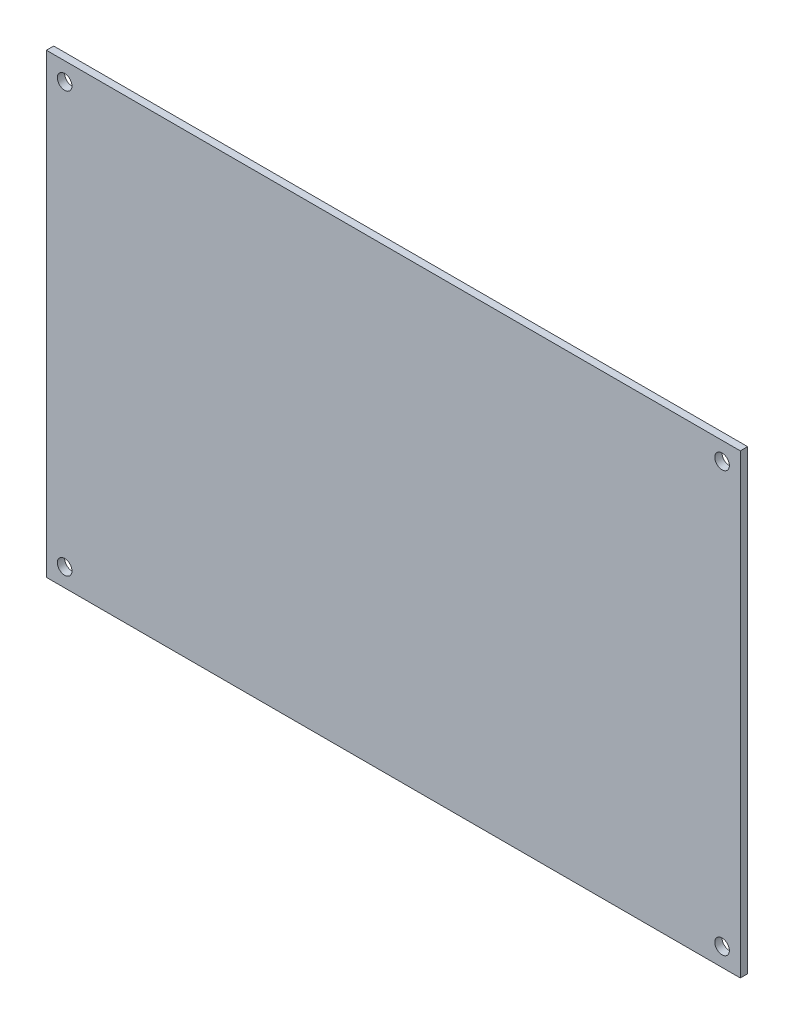
ISO-10303-21;
HEADER;
FILE_DESCRIPTION(('STEP AP214'),'2;1');
FILE_NAME('part.step','',(''),(''),'','','');
FILE_SCHEMA(('AUTOMOTIVE_DESIGN { 1 0 10303 214 1 1 1 1 }'));
ENDSEC;
DATA;
#1=APPLICATION_CONTEXT('core data for automotive mechanical design processes');
#2=APPLICATION_PROTOCOL_DEFINITION('international standard','automotive_design',2000,#1);
#3=PRODUCT_CONTEXT('',#1,'mechanical');
#4=PRODUCT('Part','Part','',(#3));
#5=PRODUCT_RELATED_PRODUCT_CATEGORY('part','',(#4));
#6=PRODUCT_DEFINITION_FORMATION('','',#4);
#7=PRODUCT_DEFINITION_CONTEXT('part definition',#1,'design');
#8=PRODUCT_DEFINITION('design','',#6,#7);
#9=PRODUCT_DEFINITION_SHAPE('','',#8);
#10=(LENGTH_UNIT() NAMED_UNIT(*) SI_UNIT(.MILLI.,.METRE.));
#11=(NAMED_UNIT(*) PLANE_ANGLE_UNIT() SI_UNIT($,.RADIAN.));
#12=(NAMED_UNIT(*) SI_UNIT($,.STERADIAN.) SOLID_ANGLE_UNIT());
#13=UNCERTAINTY_MEASURE_WITH_UNIT(LENGTH_MEASURE(1.E-05),#10,'distance_accuracy_value','');
#14=(GEOMETRIC_REPRESENTATION_CONTEXT(3) GLOBAL_UNCERTAINTY_ASSIGNED_CONTEXT((#13)) GLOBAL_UNIT_ASSIGNED_CONTEXT((#10,
#11,#12)) REPRESENTATION_CONTEXT('',''));
#15=CARTESIAN_POINT('',(0.,0.,0.));
#16=DIRECTION('',(0.,0.,1.));
#17=DIRECTION('',(1.,0.,0.));
#18=AXIS2_PLACEMENT_3D('',#15,#16,#17);
#19=CARTESIAN_POINT('',(0.,0.,4.));
#20=DIRECTION('',(0.,0.,-1.));
#21=DIRECTION('',(-1.,0.,0.));
#22=AXIS2_PLACEMENT_3D('',#19,#20,#21);
#23=PLANE('',#22);
#24=CARTESIAN_POINT('',(370.000000000006,9.99999999999998,4.));
#25=DIRECTION('',(0.,0.,1.));
#26=DIRECTION('',(1.,0.,0.));
#27=AXIS2_PLACEMENT_3D('',#24,#25,#26);
#28=CIRCLE('',#27,3.99999999999999);
#29=CARTESIAN_POINT('',(374.000000000006,9.99999999999998,4.));
#30=VERTEX_POINT('',#29);
#31=EDGE_CURVE('E122',#30,#30,#28,.T.);
#32=ORIENTED_EDGE('',*,*,#31,.F.);
#33=EDGE_LOOP('',(#32));
#34=FACE_BOUND('',#33,.T.);
#35=CARTESIAN_POINT('',(10.,240.,4.));
#36=DIRECTION('',(0.,0.,1.));
#37=DIRECTION('',(1.,0.,0.));
#38=AXIS2_PLACEMENT_3D('',#35,#36,#37);
#39=CIRCLE('',#38,4.00000000000001);
#40=CARTESIAN_POINT('',(14.,240.,4.));
#41=VERTEX_POINT('',#40);
#42=EDGE_CURVE('E101',#41,#41,#39,.T.);
#43=ORIENTED_EDGE('',*,*,#42,.F.);
#44=EDGE_LOOP('',(#43));
#45=FACE_BOUND('',#44,.T.);
#46=DIRECTION('',(0.,-1.,0.));
#47=VECTOR('',#46,1.);
#48=CARTESIAN_POINT('',(0.,0.,4.));
#49=LINE('',#48,#47);
#50=CARTESIAN_POINT('',(0.,250.,4.));
#51=VERTEX_POINT('',#50);
#52=CARTESIAN_POINT('',(0.,0.,4.));
#53=VERTEX_POINT('',#52);
#54=EDGE_CURVE('E86',#51,#53,#49,.T.);
#55=ORIENTED_EDGE('',*,*,#54,.T.);
#56=DIRECTION('',(1.,0.,0.));
#57=VECTOR('',#56,1.);
#58=CARTESIAN_POINT('',(0.,0.,4.));
#59=LINE('',#58,#57);
#60=CARTESIAN_POINT('',(380.,0.,4.));
#61=VERTEX_POINT('',#60);
#62=EDGE_CURVE('E81',#53,#61,#59,.T.);
#63=ORIENTED_EDGE('',*,*,#62,.T.);
#64=DIRECTION('',(0.,1.,0.));
#65=VECTOR('',#64,1.);
#66=CARTESIAN_POINT('',(380.,0.,4.));
#67=LINE('',#66,#65);
#68=CARTESIAN_POINT('',(380.,250.,4.));
#69=VERTEX_POINT('',#68);
#70=EDGE_CURVE('E84',#61,#69,#67,.T.);
#71=ORIENTED_EDGE('',*,*,#70,.T.);
#72=DIRECTION('',(-1.,0.,0.));
#73=VECTOR('',#72,1.);
#74=CARTESIAN_POINT('',(0.,250.,4.));
#75=LINE('',#74,#73);
#76=EDGE_CURVE('E51',#69,#51,#75,.T.);
#77=ORIENTED_EDGE('',*,*,#76,.T.);
#78=EDGE_LOOP('',(#55,#63,#71,#77));
#79=FACE_BOUND('',#78,.T.);
#80=CARTESIAN_POINT('',(370.,240.,4.));
#81=DIRECTION('',(0.,0.,1.));
#82=DIRECTION('',(1.,0.,0.));
#83=AXIS2_PLACEMENT_3D('',#80,#81,#82);
#84=CIRCLE('',#83,3.99999999999999);
#85=CARTESIAN_POINT('',(374.,240.,4.));
#86=VERTEX_POINT('',#85);
#87=EDGE_CURVE('E116',#86,#86,#84,.T.);
#88=ORIENTED_EDGE('',*,*,#87,.F.);
#89=EDGE_LOOP('',(#88));
#90=FACE_BOUND('',#89,.T.);
#91=CARTESIAN_POINT('',(10.0000000000057,9.99999999999998,4.));
#92=DIRECTION('',(0.,0.,1.));
#93=DIRECTION('',(1.,0.,0.));
#94=AXIS2_PLACEMENT_3D('',#91,#92,#93);
#95=CIRCLE('',#94,4.00000000000001);
#96=CARTESIAN_POINT('',(14.0000000000057,9.99999999999998,4.));
#97=VERTEX_POINT('',#96);
#98=EDGE_CURVE('E128',#97,#97,#95,.T.);
#99=ORIENTED_EDGE('',*,*,#98,.F.);
#100=EDGE_LOOP('',(#99));
#101=FACE_BOUND('',#100,.T.);
#102=ADVANCED_FACE('F34',(#34,#45,#79,#90,#101),#23,.F.);
#103=CARTESIAN_POINT('',(0.,0.,0.));
#104=DIRECTION('',(0.,0.,-1.));
#105=DIRECTION('',(-1.,0.,0.));
#106=AXIS2_PLACEMENT_3D('',#103,#104,#105);
#107=PLANE('',#106);
#108=CARTESIAN_POINT('',(370.000000000006,9.99999999999998,0.));
#109=DIRECTION('',(0.,0.,1.));
#110=DIRECTION('',(1.,0.,0.));
#111=AXIS2_PLACEMENT_3D('',#108,#109,#110);
#112=CIRCLE('',#111,3.99999999999999);
#113=CARTESIAN_POINT('',(374.000000000006,9.99999999999998,0.));
#114=VERTEX_POINT('',#113);
#115=EDGE_CURVE('E125',#114,#114,#112,.T.);
#116=ORIENTED_EDGE('',*,*,#115,.T.);
#117=EDGE_LOOP('',(#116));
#118=FACE_BOUND('',#117,.T.);
#119=CARTESIAN_POINT('',(10.,240.,0.));
#120=DIRECTION('',(0.,0.,1.));
#121=DIRECTION('',(1.,0.,0.));
#122=AXIS2_PLACEMENT_3D('',#119,#120,#121);
#123=CIRCLE('',#122,4.00000000000001);
#124=CARTESIAN_POINT('',(14.,240.,0.));
#125=VERTEX_POINT('',#124);
#126=EDGE_CURVE('E113',#125,#125,#123,.T.);
#127=ORIENTED_EDGE('',*,*,#126,.T.);
#128=EDGE_LOOP('',(#127));
#129=FACE_BOUND('',#128,.T.);
#130=DIRECTION('',(0.,-1.,0.));
#131=VECTOR('',#130,1.);
#132=CARTESIAN_POINT('',(0.,0.,0.));
#133=LINE('',#132,#131);
#134=CARTESIAN_POINT('',(0.,250.,0.));
#135=VERTEX_POINT('',#134);
#136=CARTESIAN_POINT('',(0.,0.,0.));
#137=VERTEX_POINT('',#136);
#138=EDGE_CURVE('E98',#135,#137,#133,.T.);
#139=ORIENTED_EDGE('',*,*,#138,.F.);
#140=DIRECTION('',(-1.,0.,0.));
#141=VECTOR('',#140,1.);
#142=CARTESIAN_POINT('',(0.,250.,0.));
#143=LINE('',#142,#141);
#144=CARTESIAN_POINT('',(380.,250.,0.));
#145=VERTEX_POINT('',#144);
#146=EDGE_CURVE('E74',#145,#135,#143,.T.);
#147=ORIENTED_EDGE('',*,*,#146,.F.);
#148=DIRECTION('',(0.,1.,0.));
#149=VECTOR('',#148,1.);
#150=CARTESIAN_POINT('',(380.,0.,0.));
#151=LINE('',#150,#149);
#152=CARTESIAN_POINT('',(380.,0.,0.));
#153=VERTEX_POINT('',#152);
#154=EDGE_CURVE('E68',#153,#145,#151,.T.);
#155=ORIENTED_EDGE('',*,*,#154,.F.);
#156=DIRECTION('',(1.,0.,0.));
#157=VECTOR('',#156,1.);
#158=CARTESIAN_POINT('',(0.,0.,0.));
#159=LINE('',#158,#157);
#160=EDGE_CURVE('E90',#137,#153,#159,.T.);
#161=ORIENTED_EDGE('',*,*,#160,.F.);
#162=EDGE_LOOP('',(#139,#147,#155,#161));
#163=FACE_BOUND('',#162,.T.);
#164=CARTESIAN_POINT('',(370.,240.,0.));
#165=DIRECTION('',(0.,0.,1.));
#166=DIRECTION('',(1.,0.,0.));
#167=AXIS2_PLACEMENT_3D('',#164,#165,#166);
#168=CIRCLE('',#167,3.99999999999999);
#169=CARTESIAN_POINT('',(374.,240.,0.));
#170=VERTEX_POINT('',#169);
#171=EDGE_CURVE('E119',#170,#170,#168,.T.);
#172=ORIENTED_EDGE('',*,*,#171,.T.);
#173=EDGE_LOOP('',(#172));
#174=FACE_BOUND('',#173,.T.);
#175=CARTESIAN_POINT('',(10.0000000000057,9.99999999999998,0.));
#176=DIRECTION('',(0.,0.,1.));
#177=DIRECTION('',(1.,0.,0.));
#178=AXIS2_PLACEMENT_3D('',#175,#176,#177);
#179=CIRCLE('',#178,4.00000000000001);
#180=CARTESIAN_POINT('',(14.0000000000057,9.99999999999998,0.));
#181=VERTEX_POINT('',#180);
#182=EDGE_CURVE('E131',#181,#181,#179,.T.);
#183=ORIENTED_EDGE('',*,*,#182,.T.);
#184=EDGE_LOOP('',(#183));
#185=FACE_BOUND('',#184,.T.);
#186=ADVANCED_FACE('F109',(#118,#129,#163,#174,#185),#107,.T.);
#187=CARTESIAN_POINT('',(0.,0.,4.));
#188=DIRECTION('',(1.,0.,0.));
#189=DIRECTION('',(0.,0.,-1.));
#190=AXIS2_PLACEMENT_3D('',#187,#188,#189);
#191=PLANE('',#190);
#192=ORIENTED_EDGE('',*,*,#138,.T.);
#193=DIRECTION('',(0.,0.,-1.));
#194=VECTOR('',#193,1.);
#195=CARTESIAN_POINT('',(0.,0.,4.));
#196=LINE('',#195,#194);
#197=EDGE_CURVE('E11',#53,#137,#196,.T.);
#198=ORIENTED_EDGE('',*,*,#197,.F.);
#199=ORIENTED_EDGE('',*,*,#54,.F.);
#200=DIRECTION('',(0.,0.,-1.));
#201=VECTOR('',#200,1.);
#202=CARTESIAN_POINT('',(0.,250.,4.));
#203=LINE('',#202,#201);
#204=EDGE_CURVE('E94',#51,#135,#203,.T.);
#205=ORIENTED_EDGE('',*,*,#204,.T.);
#206=EDGE_LOOP('',(#192,#198,#199,#205));
#207=FACE_BOUND('',#206,.T.);
#208=ADVANCED_FACE('F36',(#207),#191,.F.);
#209=CARTESIAN_POINT('',(0.,0.,4.));
#210=DIRECTION('',(0.,1.,0.));
#211=DIRECTION('',(0.,0.,1.));
#212=AXIS2_PLACEMENT_3D('',#209,#210,#211);
#213=PLANE('',#212);
#214=ORIENTED_EDGE('',*,*,#160,.T.);
#215=DIRECTION('',(0.,0.,-1.));
#216=VECTOR('',#215,1.);
#217=CARTESIAN_POINT('',(380.,0.,4.));
#218=LINE('',#217,#216);
#219=EDGE_CURVE('E43',#61,#153,#218,.T.);
#220=ORIENTED_EDGE('',*,*,#219,.F.);
#221=ORIENTED_EDGE('',*,*,#62,.F.);
#222=ORIENTED_EDGE('',*,*,#197,.T.);
#223=EDGE_LOOP('',(#214,#220,#221,#222));
#224=FACE_BOUND('',#223,.T.);
#225=ADVANCED_FACE('F89',(#224),#213,.F.);
#226=CARTESIAN_POINT('',(380.,0.,4.));
#227=DIRECTION('',(-1.,0.,0.));
#228=DIRECTION('',(0.,0.,1.));
#229=AXIS2_PLACEMENT_3D('',#226,#227,#228);
#230=PLANE('',#229);
#231=ORIENTED_EDGE('',*,*,#154,.T.);
#232=DIRECTION('',(0.,0.,-1.));
#233=VECTOR('',#232,1.);
#234=CARTESIAN_POINT('',(380.,250.,4.));
#235=LINE('',#234,#233);
#236=EDGE_CURVE('E91',#69,#145,#235,.T.);
#237=ORIENTED_EDGE('',*,*,#236,.F.);
#238=ORIENTED_EDGE('',*,*,#70,.F.);
#239=ORIENTED_EDGE('',*,*,#219,.T.);
#240=EDGE_LOOP('',(#231,#237,#238,#239));
#241=FACE_BOUND('',#240,.T.);
#242=ADVANCED_FACE('F92',(#241),#230,.F.);
#243=CARTESIAN_POINT('',(0.,250.,4.));
#244=DIRECTION('',(0.,-1.,0.));
#245=DIRECTION('',(0.,0.,-1.));
#246=AXIS2_PLACEMENT_3D('',#243,#244,#245);
#247=PLANE('',#246);
#248=ORIENTED_EDGE('',*,*,#146,.T.);
#249=ORIENTED_EDGE('',*,*,#204,.F.);
#250=ORIENTED_EDGE('',*,*,#76,.F.);
#251=ORIENTED_EDGE('',*,*,#236,.T.);
#252=EDGE_LOOP('',(#248,#249,#250,#251));
#253=FACE_BOUND('',#252,.T.);
#254=ADVANCED_FACE('F106',(#253),#247,.F.);
#255=CARTESIAN_POINT('',(10.,240.,4.));
#256=DIRECTION('',(0.,0.,-1.));
#257=DIRECTION('',(-1.,0.,0.));
#258=AXIS2_PLACEMENT_3D('',#255,#256,#257);
#259=CYLINDRICAL_SURFACE('',#258,4.00000000000001);
#260=ORIENTED_EDGE('',*,*,#42,.T.);
#261=EDGE_LOOP('',(#260));
#262=FACE_BOUND('',#261,.T.);
#263=ORIENTED_EDGE('',*,*,#126,.F.);
#264=EDGE_LOOP('',(#263));
#265=FACE_BOUND('',#264,.T.);
#266=ADVANCED_FACE('F151',(#262,#265),#259,.F.);
#267=CARTESIAN_POINT('',(370.,240.,4.));
#268=DIRECTION('',(0.,0.,-1.));
#269=DIRECTION('',(-1.,0.,0.));
#270=AXIS2_PLACEMENT_3D('',#267,#268,#269);
#271=CYLINDRICAL_SURFACE('',#270,3.99999999999999);
#272=ORIENTED_EDGE('',*,*,#87,.T.);
#273=EDGE_LOOP('',(#272));
#274=FACE_BOUND('',#273,.T.);
#275=ORIENTED_EDGE('',*,*,#171,.F.);
#276=EDGE_LOOP('',(#275));
#277=FACE_BOUND('',#276,.T.);
#278=ADVANCED_FACE('F178',(#274,#277),#271,.F.);
#279=CARTESIAN_POINT('',(370.000000000006,9.99999999999998,4.));
#280=DIRECTION('',(0.,0.,-1.));
#281=DIRECTION('',(-1.,0.,0.));
#282=AXIS2_PLACEMENT_3D('',#279,#280,#281);
#283=CYLINDRICAL_SURFACE('',#282,3.99999999999999);
#284=ORIENTED_EDGE('',*,*,#31,.T.);
#285=EDGE_LOOP('',(#284));
#286=FACE_BOUND('',#285,.T.);
#287=ORIENTED_EDGE('',*,*,#115,.F.);
#288=EDGE_LOOP('',(#287));
#289=FACE_BOUND('',#288,.T.);
#290=ADVANCED_FACE('F188',(#286,#289),#283,.F.);
#291=CARTESIAN_POINT('',(10.0000000000057,9.99999999999998,4.));
#292=DIRECTION('',(0.,0.,-1.));
#293=DIRECTION('',(-1.,0.,0.));
#294=AXIS2_PLACEMENT_3D('',#291,#292,#293);
#295=CYLINDRICAL_SURFACE('',#294,4.00000000000001);
#296=ORIENTED_EDGE('',*,*,#98,.T.);
#297=EDGE_LOOP('',(#296));
#298=FACE_BOUND('',#297,.T.);
#299=ORIENTED_EDGE('',*,*,#182,.F.);
#300=EDGE_LOOP('',(#299));
#301=FACE_BOUND('',#300,.T.);
#302=ADVANCED_FACE('F137',(#298,#301),#295,.F.);
#303=CLOSED_SHELL('',(#102,#186,#208,#225,#242,#254,#266,#278,#290,#302));
#304=MANIFOLD_SOLID_BREP('B2',#303);
#305=ADVANCED_BREP_SHAPE_REPRESENTATION('',(#18,#304),#14);
#306=SHAPE_DEFINITION_REPRESENTATION(#9,#305);
ENDSEC;
END-ISO-10303-21;
